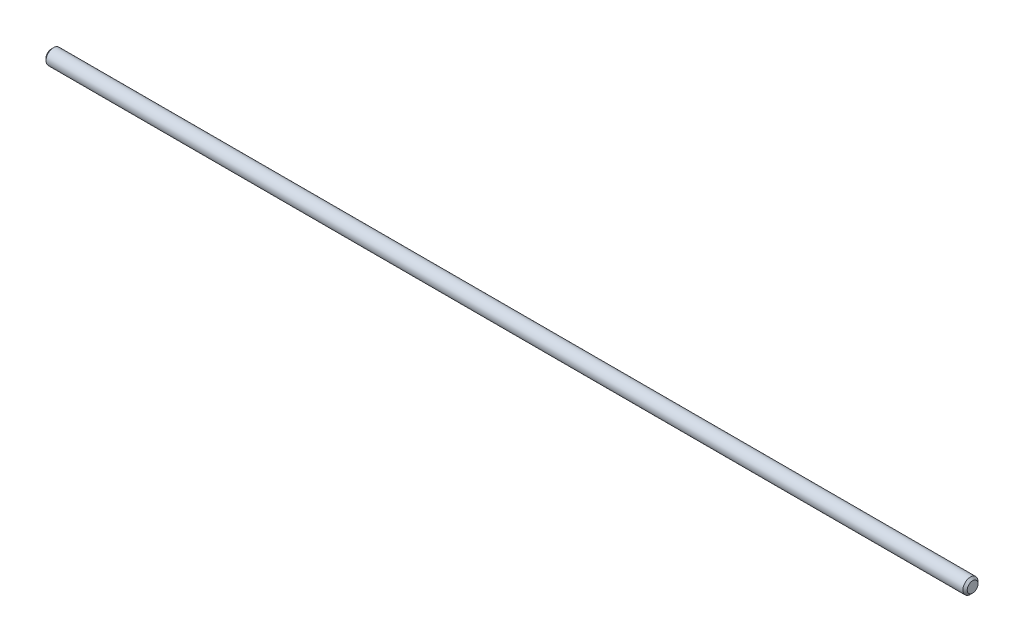
ISO-10303-21;
HEADER;
FILE_DESCRIPTION(('STEP AP214'),'2;1');
FILE_NAME('part.step','',(''),(''),'','','');
FILE_SCHEMA(('AUTOMOTIVE_DESIGN { 1 0 10303 214 1 1 1 1 }'));
ENDSEC;
DATA;
#1=APPLICATION_CONTEXT('core data for automotive mechanical design processes');
#2=APPLICATION_PROTOCOL_DEFINITION('international standard','automotive_design',2000,#1);
#3=PRODUCT_CONTEXT('',#1,'mechanical');
#4=PRODUCT('Part','Part','',(#3));
#5=PRODUCT_RELATED_PRODUCT_CATEGORY('part','',(#4));
#6=PRODUCT_DEFINITION_FORMATION('','',#4);
#7=PRODUCT_DEFINITION_CONTEXT('part definition',#1,'design');
#8=PRODUCT_DEFINITION('design','',#6,#7);
#9=PRODUCT_DEFINITION_SHAPE('','',#8);
#10=(LENGTH_UNIT() NAMED_UNIT(*) SI_UNIT(.MILLI.,.METRE.));
#11=(NAMED_UNIT(*) PLANE_ANGLE_UNIT() SI_UNIT($,.RADIAN.));
#12=(NAMED_UNIT(*) SI_UNIT($,.STERADIAN.) SOLID_ANGLE_UNIT());
#13=UNCERTAINTY_MEASURE_WITH_UNIT(LENGTH_MEASURE(1.E-05),#10,'distance_accuracy_value','');
#14=(GEOMETRIC_REPRESENTATION_CONTEXT(3) GLOBAL_UNCERTAINTY_ASSIGNED_CONTEXT((#13)) GLOBAL_UNIT_ASSIGNED_CONTEXT((#10,
#11,#12)) REPRESENTATION_CONTEXT('',''));
#15=CARTESIAN_POINT('',(0.,0.,0.));
#16=DIRECTION('',(0.,0.,1.));
#17=DIRECTION('',(1.,0.,0.));
#18=AXIS2_PLACEMENT_3D('',#15,#16,#17);
#19=CARTESIAN_POINT('',(-127.,0.,0.));
#20=DIRECTION('',(1.,0.,0.));
#21=DIRECTION('',(0.,0.,-1.));
#22=AXIS2_PLACEMENT_3D('',#19,#20,#21);
#23=CYLINDRICAL_SURFACE('',#22,2.0828);
#24=CARTESIAN_POINT('',(-126.4046875,0.,0.));
#25=DIRECTION('',(1.,0.,0.));
#26=DIRECTION('',(0.,0.,-1.));
#27=AXIS2_PLACEMENT_3D('',#24,#25,#26);
#28=CIRCLE('',#27,2.0828);
#29=CARTESIAN_POINT('',(-126.4046875,0.,-2.0828));
#30=VERTEX_POINT('',#29);
#31=EDGE_CURVE('E54',#30,#30,#28,.T.);
#32=ORIENTED_EDGE('',*,*,#31,.T.);
#33=EDGE_LOOP('',(#32));
#34=FACE_BOUND('',#33,.T.);
#35=CARTESIAN_POINT('',(126.4046875,0.,0.));
#36=DIRECTION('',(1.,0.,0.));
#37=DIRECTION('',(0.,0.,-1.));
#38=AXIS2_PLACEMENT_3D('',#35,#36,#37);
#39=CIRCLE('',#38,2.0828);
#40=CARTESIAN_POINT('',(126.4046875,0.,-2.0828));
#41=VERTEX_POINT('',#40);
#42=EDGE_CURVE('E59',#41,#41,#39,.F.);
#43=ORIENTED_EDGE('',*,*,#42,.T.);
#44=EDGE_LOOP('',(#43));
#45=FACE_BOUND('',#44,.T.);
#46=ADVANCED_FACE('F41',(#34,#45),#23,.T.);
#47=CARTESIAN_POINT('',(-127.,0.,0.));
#48=DIRECTION('',(1.,0.,0.));
#49=DIRECTION('',(0.,0.,-1.));
#50=AXIS2_PLACEMENT_3D('',#47,#48,#49);
#51=PLANE('',#50);
#52=CARTESIAN_POINT('',(-127.,0.,0.));
#53=DIRECTION('',(1.,0.,0.));
#54=DIRECTION('',(0.,0.,-1.));
#55=AXIS2_PLACEMENT_3D('',#52,#53,#54);
#56=CIRCLE('',#55,1.48748750000011);
#57=CARTESIAN_POINT('',(-127.,0.,-1.48748750000011));
#58=VERTEX_POINT('',#57);
#59=EDGE_CURVE('E49',#58,#58,#56,.F.);
#60=ORIENTED_EDGE('',*,*,#59,.T.);
#61=EDGE_LOOP('',(#60));
#62=FACE_BOUND('',#61,.T.);
#63=ADVANCED_FACE('F76',(#62),#51,.F.);
#64=CARTESIAN_POINT('',(127.,0.,0.));
#65=DIRECTION('',(1.,0.,0.));
#66=DIRECTION('',(0.,0.,-1.));
#67=AXIS2_PLACEMENT_3D('',#64,#65,#66);
#68=PLANE('',#67);
#69=CARTESIAN_POINT('',(127.,0.,0.));
#70=DIRECTION('',(1.,0.,0.));
#71=DIRECTION('',(0.,0.,-1.));
#72=AXIS2_PLACEMENT_3D('',#69,#70,#71);
#73=CIRCLE('',#72,1.48748750000002);
#74=CARTESIAN_POINT('',(127.,0.,-1.48748750000002));
#75=VERTEX_POINT('',#74);
#76=EDGE_CURVE('E10',#75,#75,#73,.T.);
#77=ORIENTED_EDGE('',*,*,#76,.T.);
#78=EDGE_LOOP('',(#77));
#79=FACE_BOUND('',#78,.T.);
#80=ADVANCED_FACE('F73',(#79),#68,.T.);
#81=CARTESIAN_POINT('',(-126.4046875,0.,0.));
#82=DIRECTION('',(1.,0.,0.));
#83=DIRECTION('',(0.,0.,-1.));
#84=AXIS2_PLACEMENT_3D('',#81,#82,#83);
#85=CONICAL_SURFACE('',#84,2.0828,0.785398163397452);
#86=ORIENTED_EDGE('',*,*,#59,.F.);
#87=EDGE_LOOP('',(#86));
#88=FACE_BOUND('',#87,.T.);
#89=ORIENTED_EDGE('',*,*,#31,.F.);
#90=EDGE_LOOP('',(#89));
#91=FACE_BOUND('',#90,.T.);
#92=ADVANCED_FACE('F69',(#88,#91),#85,.T.);
#93=CARTESIAN_POINT('',(127.,0.,0.));
#94=DIRECTION('',(-1.,0.,0.));
#95=DIRECTION('',(0.,0.,1.));
#96=AXIS2_PLACEMENT_3D('',#93,#94,#95);
#97=CONICAL_SURFACE('',#96,1.48748750000002,0.785398163397429);
#98=ORIENTED_EDGE('',*,*,#42,.F.);
#99=EDGE_LOOP('',(#98));
#100=FACE_BOUND('',#99,.T.);
#101=ORIENTED_EDGE('',*,*,#76,.F.);
#102=EDGE_LOOP('',(#101));
#103=FACE_BOUND('',#102,.T.);
#104=ADVANCED_FACE('F43',(#100,#103),#97,.T.);
#105=CLOSED_SHELL('',(#46,#63,#80,#92,#104));
#106=MANIFOLD_SOLID_BREP('B2',#105);
#107=ADVANCED_BREP_SHAPE_REPRESENTATION('',(#18,#106),#14);
#108=SHAPE_DEFINITION_REPRESENTATION(#9,#107);
ENDSEC;
END-ISO-10303-21;
